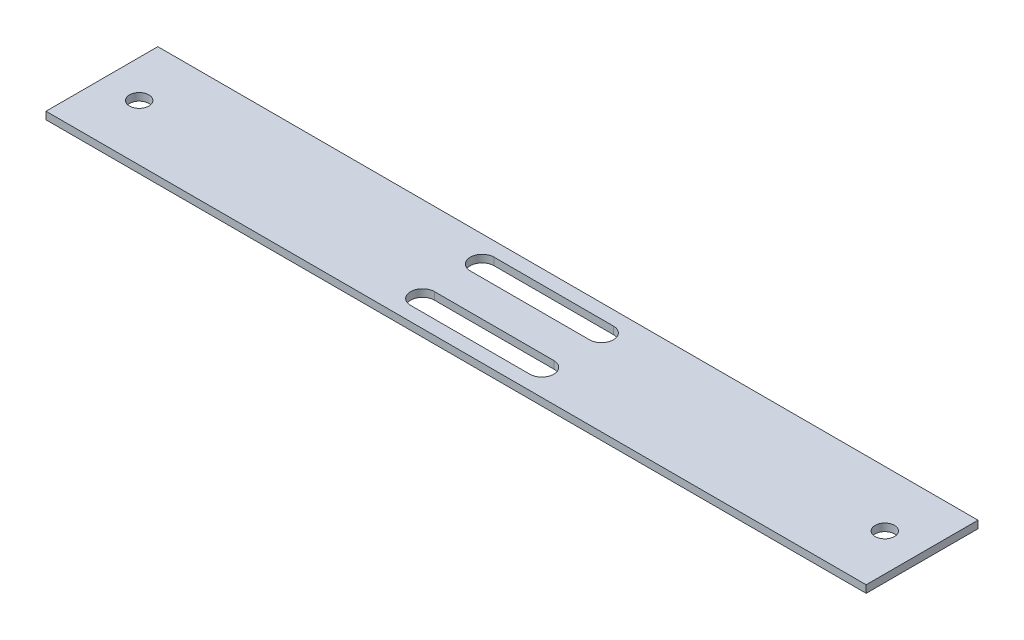
ISO-10303-21;
HEADER;
FILE_DESCRIPTION(('STEP AP214'),'2;1');
FILE_NAME('part.step','',(''),(''),'','','');
FILE_SCHEMA(('AUTOMOTIVE_DESIGN { 1 0 10303 214 1 1 1 1 }'));
ENDSEC;
DATA;
#1=APPLICATION_CONTEXT('core data for automotive mechanical design processes');
#2=APPLICATION_PROTOCOL_DEFINITION('international standard','automotive_design',2000,#1);
#3=PRODUCT_CONTEXT('',#1,'mechanical');
#4=PRODUCT('Part','Part','',(#3));
#5=PRODUCT_RELATED_PRODUCT_CATEGORY('part','',(#4));
#6=PRODUCT_DEFINITION_FORMATION('','',#4);
#7=PRODUCT_DEFINITION_CONTEXT('part definition',#1,'design');
#8=PRODUCT_DEFINITION('design','',#6,#7);
#9=PRODUCT_DEFINITION_SHAPE('','',#8);
#10=(LENGTH_UNIT() NAMED_UNIT(*) SI_UNIT(.MILLI.,.METRE.));
#11=(NAMED_UNIT(*) PLANE_ANGLE_UNIT() SI_UNIT($,.RADIAN.));
#12=(NAMED_UNIT(*) SI_UNIT($,.STERADIAN.) SOLID_ANGLE_UNIT());
#13=UNCERTAINTY_MEASURE_WITH_UNIT(LENGTH_MEASURE(1.E-05),#10,'distance_accuracy_value','');
#14=(GEOMETRIC_REPRESENTATION_CONTEXT(3) GLOBAL_UNCERTAINTY_ASSIGNED_CONTEXT((#13)) GLOBAL_UNIT_ASSIGNED_CONTEXT((#10,
#11,#12)) REPRESENTATION_CONTEXT('',''));
#15=CARTESIAN_POINT('',(0.,0.,0.));
#16=DIRECTION('',(0.,0.,1.));
#17=DIRECTION('',(1.,0.,0.));
#18=AXIS2_PLACEMENT_3D('',#15,#16,#17);
#19=CARTESIAN_POINT('',(110.,2.,-15.));
#20=DIRECTION('',(0.,1.,0.));
#21=DIRECTION('',(0.,0.,1.));
#22=AXIS2_PLACEMENT_3D('',#19,#20,#21);
#23=PLANE('',#22);
#24=CARTESIAN_POINT('',(-16.,2.,-8.));
#25=DIRECTION('',(0.,1.,0.));
#26=DIRECTION('',(0.,0.,1.));
#27=AXIS2_PLACEMENT_3D('',#24,#25,#26);
#28=CIRCLE('',#27,3.2);
#29=CARTESIAN_POINT('',(-16.,2.,-11.2));
#30=VERTEX_POINT('',#29);
#31=CARTESIAN_POINT('',(-16.,2.,-4.8));
#32=VERTEX_POINT('',#31);
#33=EDGE_CURVE('E143',#30,#32,#28,.T.);
#34=ORIENTED_EDGE('',*,*,#33,.F.);
#35=DIRECTION('',(-1.,0.,0.));
#36=VECTOR('',#35,1.);
#37=CARTESIAN_POINT('',(-16.,2.,-11.2));
#38=LINE('',#37,#36);
#39=CARTESIAN_POINT('',(16.,2.,-11.2));
#40=VERTEX_POINT('',#39);
#41=EDGE_CURVE('E144',#40,#30,#38,.T.);
#42=ORIENTED_EDGE('',*,*,#41,.F.);
#43=CARTESIAN_POINT('',(16.,2.,-8.));
#44=DIRECTION('',(0.,1.,0.));
#45=DIRECTION('',(0.,0.,1.));
#46=AXIS2_PLACEMENT_3D('',#43,#44,#45);
#47=CIRCLE('',#46,3.2);
#48=CARTESIAN_POINT('',(16.,2.,-4.8));
#49=VERTEX_POINT('',#48);
#50=EDGE_CURVE('E158',#49,#40,#47,.T.);
#51=ORIENTED_EDGE('',*,*,#50,.F.);
#52=DIRECTION('',(1.,0.,0.));
#53=VECTOR('',#52,1.);
#54=CARTESIAN_POINT('',(-16.,2.,-4.8));
#55=LINE('',#54,#53);
#56=EDGE_CURVE('E151',#32,#49,#55,.T.);
#57=ORIENTED_EDGE('',*,*,#56,.F.);
#58=EDGE_LOOP('',(#34,#42,#51,#57));
#59=FACE_BOUND('',#58,.T.);
#60=CARTESIAN_POINT('',(-16.,2.,8.));
#61=DIRECTION('',(0.,1.,0.));
#62=DIRECTION('',(0.,0.,1.));
#63=AXIS2_PLACEMENT_3D('',#60,#61,#62);
#64=CIRCLE('',#63,3.2);
#65=CARTESIAN_POINT('',(-16.,2.,4.8));
#66=VERTEX_POINT('',#65);
#67=CARTESIAN_POINT('',(-16.,2.,11.2));
#68=VERTEX_POINT('',#67);
#69=EDGE_CURVE('E186',#66,#68,#64,.T.);
#70=ORIENTED_EDGE('',*,*,#69,.F.);
#71=DIRECTION('',(-1.,0.,0.));
#72=VECTOR('',#71,1.);
#73=CARTESIAN_POINT('',(-16.,2.,4.8));
#74=LINE('',#73,#72);
#75=CARTESIAN_POINT('',(16.,2.,4.8));
#76=VERTEX_POINT('',#75);
#77=EDGE_CURVE('E174',#76,#66,#74,.T.);
#78=ORIENTED_EDGE('',*,*,#77,.F.);
#79=CARTESIAN_POINT('',(16.,2.,8.));
#80=DIRECTION('',(0.,1.,0.));
#81=DIRECTION('',(0.,0.,1.));
#82=AXIS2_PLACEMENT_3D('',#79,#80,#81);
#83=CIRCLE('',#82,3.2);
#84=CARTESIAN_POINT('',(16.,2.,11.2));
#85=VERTEX_POINT('',#84);
#86=EDGE_CURVE('E181',#85,#76,#83,.T.);
#87=ORIENTED_EDGE('',*,*,#86,.F.);
#88=DIRECTION('',(1.,0.,0.));
#89=VECTOR('',#88,1.);
#90=CARTESIAN_POINT('',(-16.,2.,11.2));
#91=LINE('',#90,#89);
#92=EDGE_CURVE('E184',#68,#85,#91,.T.);
#93=ORIENTED_EDGE('',*,*,#92,.F.);
#94=EDGE_LOOP('',(#70,#78,#87,#93));
#95=FACE_BOUND('',#94,.T.);
#96=CARTESIAN_POINT('',(-100.,2.,0.));
#97=DIRECTION('',(0.,1.,0.));
#98=DIRECTION('',(0.,0.,1.));
#99=AXIS2_PLACEMENT_3D('',#96,#97,#98);
#100=CIRCLE('',#99,2.6);
#101=CARTESIAN_POINT('',(-100.,2.,2.6));
#102=VERTEX_POINT('',#101);
#103=EDGE_CURVE('E197',#102,#102,#100,.T.);
#104=ORIENTED_EDGE('',*,*,#103,.F.);
#105=EDGE_LOOP('',(#104));
#106=FACE_BOUND('',#105,.T.);
#107=CARTESIAN_POINT('',(100.,2.,0.));
#108=DIRECTION('',(0.,1.,0.));
#109=DIRECTION('',(0.,0.,1.));
#110=AXIS2_PLACEMENT_3D('',#107,#108,#109);
#111=CIRCLE('',#110,2.6);
#112=CARTESIAN_POINT('',(100.,2.,2.6));
#113=VERTEX_POINT('',#112);
#114=EDGE_CURVE('E135',#113,#113,#111,.T.);
#115=ORIENTED_EDGE('',*,*,#114,.F.);
#116=EDGE_LOOP('',(#115));
#117=FACE_BOUND('',#116,.T.);
#118=DIRECTION('',(0.,0.,-1.));
#119=VECTOR('',#118,1.);
#120=CARTESIAN_POINT('',(110.,2.,15.));
#121=LINE('',#120,#119);
#122=CARTESIAN_POINT('',(110.,2.,15.));
#123=VERTEX_POINT('',#122);
#124=CARTESIAN_POINT('',(110.,2.,-15.));
#125=VERTEX_POINT('',#124);
#126=EDGE_CURVE('E41',#123,#125,#121,.T.);
#127=ORIENTED_EDGE('',*,*,#126,.T.);
#128=DIRECTION('',(-1.,0.,0.));
#129=VECTOR('',#128,1.);
#130=CARTESIAN_POINT('',(-110.,2.,-15.));
#131=LINE('',#130,#129);
#132=CARTESIAN_POINT('',(-110.,2.,-15.));
#133=VERTEX_POINT('',#132);
#134=EDGE_CURVE('E228',#125,#133,#131,.T.);
#135=ORIENTED_EDGE('',*,*,#134,.T.);
#136=DIRECTION('',(0.,0.,1.));
#137=VECTOR('',#136,1.);
#138=CARTESIAN_POINT('',(-110.,2.,15.));
#139=LINE('',#138,#137);
#140=CARTESIAN_POINT('',(-110.,2.,15.));
#141=VERTEX_POINT('',#140);
#142=EDGE_CURVE('E227',#133,#141,#139,.T.);
#143=ORIENTED_EDGE('',*,*,#142,.T.);
#144=DIRECTION('',(1.,0.,0.));
#145=VECTOR('',#144,1.);
#146=CARTESIAN_POINT('',(-110.,2.,15.));
#147=LINE('',#146,#145);
#148=EDGE_CURVE('E220',#141,#123,#147,.T.);
#149=ORIENTED_EDGE('',*,*,#148,.T.);
#150=EDGE_LOOP('',(#127,#135,#143,#149));
#151=FACE_BOUND('',#150,.T.);
#152=ADVANCED_FACE('F38',(#59,#95,#106,#117,#151),#23,.T.);
#153=CARTESIAN_POINT('',(-110.,2.,-15.));
#154=DIRECTION('',(0.,0.,1.));
#155=DIRECTION('',(1.,0.,0.));
#156=AXIS2_PLACEMENT_3D('',#153,#154,#155);
#157=PLANE('',#156);
#158=DIRECTION('',(-1.,0.,0.));
#159=VECTOR('',#158,1.);
#160=CARTESIAN_POINT('',(-110.,0.,-15.));
#161=LINE('',#160,#159);
#162=CARTESIAN_POINT('',(110.,0.,-15.));
#163=VERTEX_POINT('',#162);
#164=CARTESIAN_POINT('',(-110.,0.,-15.));
#165=VERTEX_POINT('',#164);
#166=EDGE_CURVE('E46',#163,#165,#161,.T.);
#167=ORIENTED_EDGE('',*,*,#166,.T.);
#168=DIRECTION('',(0.,-1.,0.));
#169=VECTOR('',#168,1.);
#170=CARTESIAN_POINT('',(-110.,2.,-15.));
#171=LINE('',#170,#169);
#172=EDGE_CURVE('E211',#133,#165,#171,.T.);
#173=ORIENTED_EDGE('',*,*,#172,.F.);
#174=ORIENTED_EDGE('',*,*,#134,.F.);
#175=DIRECTION('',(0.,-1.,0.));
#176=VECTOR('',#175,1.);
#177=CARTESIAN_POINT('',(110.,2.,-15.));
#178=LINE('',#177,#176);
#179=EDGE_CURVE('E200',#125,#163,#178,.T.);
#180=ORIENTED_EDGE('',*,*,#179,.T.);
#181=EDGE_LOOP('',(#167,#173,#174,#180));
#182=FACE_BOUND('',#181,.T.);
#183=ADVANCED_FACE('F240',(#182),#157,.F.);
#184=CARTESIAN_POINT('',(-110.,2.,15.));
#185=DIRECTION('',(1.,0.,0.));
#186=DIRECTION('',(0.,0.,-1.));
#187=AXIS2_PLACEMENT_3D('',#184,#185,#186);
#188=PLANE('',#187);
#189=DIRECTION('',(0.,0.,1.));
#190=VECTOR('',#189,1.);
#191=CARTESIAN_POINT('',(-110.,0.,15.));
#192=LINE('',#191,#190);
#193=CARTESIAN_POINT('',(-110.,0.,15.));
#194=VERTEX_POINT('',#193);
#195=EDGE_CURVE('E223',#165,#194,#192,.T.);
#196=ORIENTED_EDGE('',*,*,#195,.T.);
#197=DIRECTION('',(0.,-1.,0.));
#198=VECTOR('',#197,1.);
#199=CARTESIAN_POINT('',(-110.,2.,15.));
#200=LINE('',#199,#198);
#201=EDGE_CURVE('E214',#141,#194,#200,.T.);
#202=ORIENTED_EDGE('',*,*,#201,.F.);
#203=ORIENTED_EDGE('',*,*,#142,.F.);
#204=ORIENTED_EDGE('',*,*,#172,.T.);
#205=EDGE_LOOP('',(#196,#202,#203,#204));
#206=FACE_BOUND('',#205,.T.);
#207=ADVANCED_FACE('F245',(#206),#188,.F.);
#208=CARTESIAN_POINT('',(110.,2.,15.));
#209=DIRECTION('',(-1.,0.,0.));
#210=DIRECTION('',(0.,0.,1.));
#211=AXIS2_PLACEMENT_3D('',#208,#209,#210);
#212=PLANE('',#211);
#213=DIRECTION('',(0.,0.,-1.));
#214=VECTOR('',#213,1.);
#215=CARTESIAN_POINT('',(110.,0.,15.));
#216=LINE('',#215,#214);
#217=CARTESIAN_POINT('',(110.,0.,15.));
#218=VERTEX_POINT('',#217);
#219=EDGE_CURVE('E11',#218,#163,#216,.T.);
#220=ORIENTED_EDGE('',*,*,#219,.T.);
#221=ORIENTED_EDGE('',*,*,#179,.F.);
#222=ORIENTED_EDGE('',*,*,#126,.F.);
#223=DIRECTION('',(0.,-1.,0.));
#224=VECTOR('',#223,1.);
#225=CARTESIAN_POINT('',(110.,2.,15.));
#226=LINE('',#225,#224);
#227=EDGE_CURVE('E217',#123,#218,#226,.T.);
#228=ORIENTED_EDGE('',*,*,#227,.T.);
#229=EDGE_LOOP('',(#220,#221,#222,#228));
#230=FACE_BOUND('',#229,.T.);
#231=ADVANCED_FACE('F237',(#230),#212,.F.);
#232=CARTESIAN_POINT('',(-16.,-0.00100000000000013,4.8));
#233=DIRECTION('',(0.,0.,-1.));
#234=DIRECTION('',(-1.,0.,0.));
#235=AXIS2_PLACEMENT_3D('',#232,#233,#234);
#236=PLANE('',#235);
#237=DIRECTION('',(0.,1.,0.));
#238=VECTOR('',#237,1.);
#239=CARTESIAN_POINT('',(16.,-0.00100000000000013,4.8));
#240=LINE('',#239,#238);
#241=CARTESIAN_POINT('',(16.,0.,4.8));
#242=VERTEX_POINT('',#241);
#243=EDGE_CURVE('E176',#242,#76,#240,.T.);
#244=ORIENTED_EDGE('',*,*,#243,.T.);
#245=ORIENTED_EDGE('',*,*,#77,.T.);
#246=DIRECTION('',(0.,1.,0.));
#247=VECTOR('',#246,1.);
#248=CARTESIAN_POINT('',(-16.,-0.00100000000000013,4.8));
#249=LINE('',#248,#247);
#250=CARTESIAN_POINT('',(-16.,0.,4.8));
#251=VERTEX_POINT('',#250);
#252=EDGE_CURVE('E170',#251,#66,#249,.T.);
#253=ORIENTED_EDGE('',*,*,#252,.F.);
#254=DIRECTION('',(-1.,0.,0.));
#255=VECTOR('',#254,1.);
#256=CARTESIAN_POINT('',(-16.,0.,4.8));
#257=LINE('',#256,#255);
#258=EDGE_CURVE('E191',#242,#251,#257,.T.);
#259=ORIENTED_EDGE('',*,*,#258,.F.);
#260=EDGE_LOOP('',(#244,#245,#253,#259));
#261=FACE_BOUND('',#260,.T.);
#262=ADVANCED_FACE('F259',(#261),#236,.F.);
#263=CARTESIAN_POINT('',(-16.,-0.00100000000000013,-11.2));
#264=DIRECTION('',(0.,0.,-1.));
#265=DIRECTION('',(-1.,0.,0.));
#266=AXIS2_PLACEMENT_3D('',#263,#264,#265);
#267=PLANE('',#266);
#268=DIRECTION('',(0.,1.,0.));
#269=VECTOR('',#268,1.);
#270=CARTESIAN_POINT('',(16.,-0.00100000000000013,-11.2));
#271=LINE('',#270,#269);
#272=CARTESIAN_POINT('',(16.,0.,-11.2));
#273=VERTEX_POINT('',#272);
#274=EDGE_CURVE('E164',#273,#40,#271,.T.);
#275=ORIENTED_EDGE('',*,*,#274,.T.);
#276=ORIENTED_EDGE('',*,*,#41,.T.);
#277=DIRECTION('',(0.,1.,0.));
#278=VECTOR('',#277,1.);
#279=CARTESIAN_POINT('',(-16.,-0.00100000000000013,-11.2));
#280=LINE('',#279,#278);
#281=CARTESIAN_POINT('',(-16.,0.,-11.2));
#282=VERTEX_POINT('',#281);
#283=EDGE_CURVE('E136',#282,#30,#280,.T.);
#284=ORIENTED_EDGE('',*,*,#283,.F.);
#285=DIRECTION('',(-1.,0.,0.));
#286=VECTOR('',#285,1.);
#287=CARTESIAN_POINT('',(-16.,0.,-11.2));
#288=LINE('',#287,#286);
#289=EDGE_CURVE('E149',#273,#282,#288,.T.);
#290=ORIENTED_EDGE('',*,*,#289,.F.);
#291=EDGE_LOOP('',(#275,#276,#284,#290));
#292=FACE_BOUND('',#291,.T.);
#293=ADVANCED_FACE('F252',(#292),#267,.F.);
#294=CARTESIAN_POINT('',(0.,0.,0.));
#295=DIRECTION('',(0.,-1.,0.));
#296=DIRECTION('',(0.,0.,-1.));
#297=AXIS2_PLACEMENT_3D('',#294,#295,#296);
#298=PLANE('',#297);
#299=CARTESIAN_POINT('',(-16.,0.,-8.));
#300=DIRECTION('',(0.,-1.,0.));
#301=DIRECTION('',(0.,0.,-1.));
#302=AXIS2_PLACEMENT_3D('',#299,#300,#301);
#303=CIRCLE('',#302,3.2);
#304=CARTESIAN_POINT('',(-16.,0.,-4.8));
#305=VERTEX_POINT('',#304);
#306=EDGE_CURVE('E140',#282,#305,#303,.F.);
#307=ORIENTED_EDGE('',*,*,#306,.T.);
#308=DIRECTION('',(1.,0.,0.));
#309=VECTOR('',#308,1.);
#310=CARTESIAN_POINT('',(-16.,0.,-4.8));
#311=LINE('',#310,#309);
#312=CARTESIAN_POINT('',(16.,0.,-4.8));
#313=VERTEX_POINT('',#312);
#314=EDGE_CURVE('E127',#305,#313,#311,.T.);
#315=ORIENTED_EDGE('',*,*,#314,.T.);
#316=CARTESIAN_POINT('',(16.,0.,-8.));
#317=DIRECTION('',(0.,-1.,0.));
#318=DIRECTION('',(0.,0.,-1.));
#319=AXIS2_PLACEMENT_3D('',#316,#317,#318);
#320=CIRCLE('',#319,3.2);
#321=EDGE_CURVE('E153',#313,#273,#320,.F.);
#322=ORIENTED_EDGE('',*,*,#321,.T.);
#323=ORIENTED_EDGE('',*,*,#289,.T.);
#324=EDGE_LOOP('',(#307,#315,#322,#323));
#325=FACE_BOUND('',#324,.T.);
#326=CARTESIAN_POINT('',(-16.,0.,8.));
#327=DIRECTION('',(0.,-1.,0.));
#328=DIRECTION('',(0.,0.,-1.));
#329=AXIS2_PLACEMENT_3D('',#326,#327,#328);
#330=CIRCLE('',#329,3.2);
#331=CARTESIAN_POINT('',(-16.,0.,11.2));
#332=VERTEX_POINT('',#331);
#333=EDGE_CURVE('E188',#251,#332,#330,.F.);
#334=ORIENTED_EDGE('',*,*,#333,.T.);
#335=DIRECTION('',(1.,0.,0.));
#336=VECTOR('',#335,1.);
#337=CARTESIAN_POINT('',(-16.,0.,11.2));
#338=LINE('',#337,#336);
#339=CARTESIAN_POINT('',(16.,0.,11.2));
#340=VERTEX_POINT('',#339);
#341=EDGE_CURVE('E167',#332,#340,#338,.T.);
#342=ORIENTED_EDGE('',*,*,#341,.T.);
#343=CARTESIAN_POINT('',(16.,0.,8.));
#344=DIRECTION('',(0.,-1.,0.));
#345=DIRECTION('',(0.,0.,-1.));
#346=AXIS2_PLACEMENT_3D('',#343,#344,#345);
#347=CIRCLE('',#346,3.2);
#348=EDGE_CURVE('E194',#340,#242,#347,.F.);
#349=ORIENTED_EDGE('',*,*,#348,.T.);
#350=ORIENTED_EDGE('',*,*,#258,.T.);
#351=EDGE_LOOP('',(#334,#342,#349,#350));
#352=FACE_BOUND('',#351,.T.);
#353=CARTESIAN_POINT('',(-100.,0.,0.));
#354=DIRECTION('',(0.,-1.,0.));
#355=DIRECTION('',(0.,0.,-1.));
#356=AXIS2_PLACEMENT_3D('',#353,#354,#355);
#357=CIRCLE('',#356,2.6);
#358=CARTESIAN_POINT('',(-100.,0.,-2.6));
#359=VERTEX_POINT('',#358);
#360=EDGE_CURVE('E201',#359,#359,#357,.F.);
#361=ORIENTED_EDGE('',*,*,#360,.T.);
#362=EDGE_LOOP('',(#361));
#363=FACE_BOUND('',#362,.T.);
#364=CARTESIAN_POINT('',(100.,0.,0.));
#365=DIRECTION('',(0.,-1.,0.));
#366=DIRECTION('',(0.,0.,-1.));
#367=AXIS2_PLACEMENT_3D('',#364,#365,#366);
#368=CIRCLE('',#367,2.6);
#369=CARTESIAN_POINT('',(100.,0.,-2.6));
#370=VERTEX_POINT('',#369);
#371=EDGE_CURVE('E204',#370,#370,#368,.F.);
#372=ORIENTED_EDGE('',*,*,#371,.T.);
#373=EDGE_LOOP('',(#372));
#374=FACE_BOUND('',#373,.T.);
#375=ORIENTED_EDGE('',*,*,#219,.F.);
#376=DIRECTION('',(1.,0.,0.));
#377=VECTOR('',#376,1.);
#378=CARTESIAN_POINT('',(-110.,0.,15.));
#379=LINE('',#378,#377);
#380=EDGE_CURVE('E221',#194,#218,#379,.T.);
#381=ORIENTED_EDGE('',*,*,#380,.F.);
#382=ORIENTED_EDGE('',*,*,#195,.F.);
#383=ORIENTED_EDGE('',*,*,#166,.F.);
#384=EDGE_LOOP('',(#375,#381,#382,#383));
#385=FACE_BOUND('',#384,.T.);
#386=ADVANCED_FACE('F147',(#325,#352,#363,#374,#385),#298,.T.);
#387=CARTESIAN_POINT('',(16.,-0.00100000000000013,-8.));
#388=DIRECTION('',(0.,1.,0.));
#389=DIRECTION('',(0.,0.,1.));
#390=AXIS2_PLACEMENT_3D('',#387,#388,#389);
#391=CYLINDRICAL_SURFACE('',#390,3.2);
#392=DIRECTION('',(0.,1.,0.));
#393=VECTOR('',#392,1.);
#394=CARTESIAN_POINT('',(16.,-0.00100000000000013,-4.8));
#395=LINE('',#394,#393);
#396=EDGE_CURVE('E54',#313,#49,#395,.T.);
#397=ORIENTED_EDGE('',*,*,#396,.T.);
#398=ORIENTED_EDGE('',*,*,#50,.T.);
#399=ORIENTED_EDGE('',*,*,#274,.F.);
#400=ORIENTED_EDGE('',*,*,#321,.F.);
#401=EDGE_LOOP('',(#397,#398,#399,#400));
#402=FACE_BOUND('',#401,.T.);
#403=ADVANCED_FACE('F251',(#402),#391,.F.);
#404=CARTESIAN_POINT('',(-16.,-0.00100000000000013,-8.));
#405=DIRECTION('',(0.,1.,0.));
#406=DIRECTION('',(0.,0.,1.));
#407=AXIS2_PLACEMENT_3D('',#404,#405,#406);
#408=CYLINDRICAL_SURFACE('',#407,3.2);
#409=ORIENTED_EDGE('',*,*,#283,.T.);
#410=ORIENTED_EDGE('',*,*,#33,.T.);
#411=DIRECTION('',(0.,1.,0.));
#412=VECTOR('',#411,1.);
#413=CARTESIAN_POINT('',(-16.,-0.00100000000000013,-4.8));
#414=LINE('',#413,#412);
#415=EDGE_CURVE('E130',#305,#32,#414,.T.);
#416=ORIENTED_EDGE('',*,*,#415,.F.);
#417=ORIENTED_EDGE('',*,*,#306,.F.);
#418=EDGE_LOOP('',(#409,#410,#416,#417));
#419=FACE_BOUND('',#418,.T.);
#420=ADVANCED_FACE('F139',(#419),#408,.F.);
#421=CARTESIAN_POINT('',(-16.,-0.00100000000000013,-4.8));
#422=DIRECTION('',(0.,0.,1.));
#423=DIRECTION('',(1.,0.,0.));
#424=AXIS2_PLACEMENT_3D('',#421,#422,#423);
#425=PLANE('',#424);
#426=ORIENTED_EDGE('',*,*,#415,.T.);
#427=ORIENTED_EDGE('',*,*,#56,.T.);
#428=ORIENTED_EDGE('',*,*,#396,.F.);
#429=ORIENTED_EDGE('',*,*,#314,.F.);
#430=EDGE_LOOP('',(#426,#427,#428,#429));
#431=FACE_BOUND('',#430,.T.);
#432=ADVANCED_FACE('F129',(#431),#425,.F.);
#433=CARTESIAN_POINT('',(16.,-0.00100000000000013,8.));
#434=DIRECTION('',(0.,1.,0.));
#435=DIRECTION('',(0.,0.,1.));
#436=AXIS2_PLACEMENT_3D('',#433,#434,#435);
#437=CYLINDRICAL_SURFACE('',#436,3.2);
#438=DIRECTION('',(0.,1.,0.));
#439=VECTOR('',#438,1.);
#440=CARTESIAN_POINT('',(16.,-0.00100000000000013,11.2));
#441=LINE('',#440,#439);
#442=EDGE_CURVE('E62',#340,#85,#441,.T.);
#443=ORIENTED_EDGE('',*,*,#442,.T.);
#444=ORIENTED_EDGE('',*,*,#86,.T.);
#445=ORIENTED_EDGE('',*,*,#243,.F.);
#446=ORIENTED_EDGE('',*,*,#348,.F.);
#447=EDGE_LOOP('',(#443,#444,#445,#446));
#448=FACE_BOUND('',#447,.T.);
#449=ADVANCED_FACE('F287',(#448),#437,.F.);
#450=CARTESIAN_POINT('',(-16.,-0.00100000000000013,8.));
#451=DIRECTION('',(0.,1.,0.));
#452=DIRECTION('',(0.,0.,1.));
#453=AXIS2_PLACEMENT_3D('',#450,#451,#452);
#454=CYLINDRICAL_SURFACE('',#453,3.2);
#455=ORIENTED_EDGE('',*,*,#252,.T.);
#456=ORIENTED_EDGE('',*,*,#69,.T.);
#457=DIRECTION('',(0.,1.,0.));
#458=VECTOR('',#457,1.);
#459=CARTESIAN_POINT('',(-16.,-0.00100000000000013,11.2));
#460=LINE('',#459,#458);
#461=EDGE_CURVE('E171',#332,#68,#460,.T.);
#462=ORIENTED_EDGE('',*,*,#461,.F.);
#463=ORIENTED_EDGE('',*,*,#333,.F.);
#464=EDGE_LOOP('',(#455,#456,#462,#463));
#465=FACE_BOUND('',#464,.T.);
#466=ADVANCED_FACE('F282',(#465),#454,.F.);
#467=CARTESIAN_POINT('',(-16.,-0.00100000000000013,11.2));
#468=DIRECTION('',(0.,0.,1.));
#469=DIRECTION('',(1.,0.,0.));
#470=AXIS2_PLACEMENT_3D('',#467,#468,#469);
#471=PLANE('',#470);
#472=ORIENTED_EDGE('',*,*,#461,.T.);
#473=ORIENTED_EDGE('',*,*,#92,.T.);
#474=ORIENTED_EDGE('',*,*,#442,.F.);
#475=ORIENTED_EDGE('',*,*,#341,.F.);
#476=EDGE_LOOP('',(#472,#473,#474,#475));
#477=FACE_BOUND('',#476,.T.);
#478=ADVANCED_FACE('F276',(#477),#471,.F.);
#479=CARTESIAN_POINT('',(-110.,2.,15.));
#480=DIRECTION('',(0.,0.,-1.));
#481=DIRECTION('',(-1.,0.,0.));
#482=AXIS2_PLACEMENT_3D('',#479,#480,#481);
#483=PLANE('',#482);
#484=ORIENTED_EDGE('',*,*,#380,.T.);
#485=ORIENTED_EDGE('',*,*,#227,.F.);
#486=ORIENTED_EDGE('',*,*,#148,.F.);
#487=ORIENTED_EDGE('',*,*,#201,.T.);
#488=EDGE_LOOP('',(#484,#485,#486,#487));
#489=FACE_BOUND('',#488,.T.);
#490=ADVANCED_FACE('F248',(#489),#483,.F.);
#491=CARTESIAN_POINT('',(100.,-0.00100000000000013,0.));
#492=DIRECTION('',(0.,1.,0.));
#493=DIRECTION('',(0.,0.,1.));
#494=AXIS2_PLACEMENT_3D('',#491,#492,#493);
#495=CYLINDRICAL_SURFACE('',#494,2.6);
#496=ORIENTED_EDGE('',*,*,#371,.F.);
#497=EDGE_LOOP('',(#496));
#498=FACE_BOUND('',#497,.T.);
#499=ORIENTED_EDGE('',*,*,#114,.T.);
#500=EDGE_LOOP('',(#499));
#501=FACE_BOUND('',#500,.T.);
#502=ADVANCED_FACE('F275',(#498,#501),#495,.F.);
#503=CARTESIAN_POINT('',(-100.,-0.00100000000000013,0.));
#504=DIRECTION('',(0.,1.,0.));
#505=DIRECTION('',(0.,0.,1.));
#506=AXIS2_PLACEMENT_3D('',#503,#504,#505);
#507=CYLINDRICAL_SURFACE('',#506,2.6);
#508=ORIENTED_EDGE('',*,*,#360,.F.);
#509=EDGE_LOOP('',(#508));
#510=FACE_BOUND('',#509,.T.);
#511=ORIENTED_EDGE('',*,*,#103,.T.);
#512=EDGE_LOOP('',(#511));
#513=FACE_BOUND('',#512,.T.);
#514=ADVANCED_FACE('F271',(#510,#513),#507,.F.);
#515=CLOSED_SHELL('',(#152,#183,#207,#231,#262,#293,#386,#403,#420,#432,#449,#466,#478,#490,
#502,#514));
#516=MANIFOLD_SOLID_BREP('B2',#515);
#517=ADVANCED_BREP_SHAPE_REPRESENTATION('',(#18,#516),#14);
#518=SHAPE_DEFINITION_REPRESENTATION(#9,#517);
ENDSEC;
END-ISO-10303-21;
